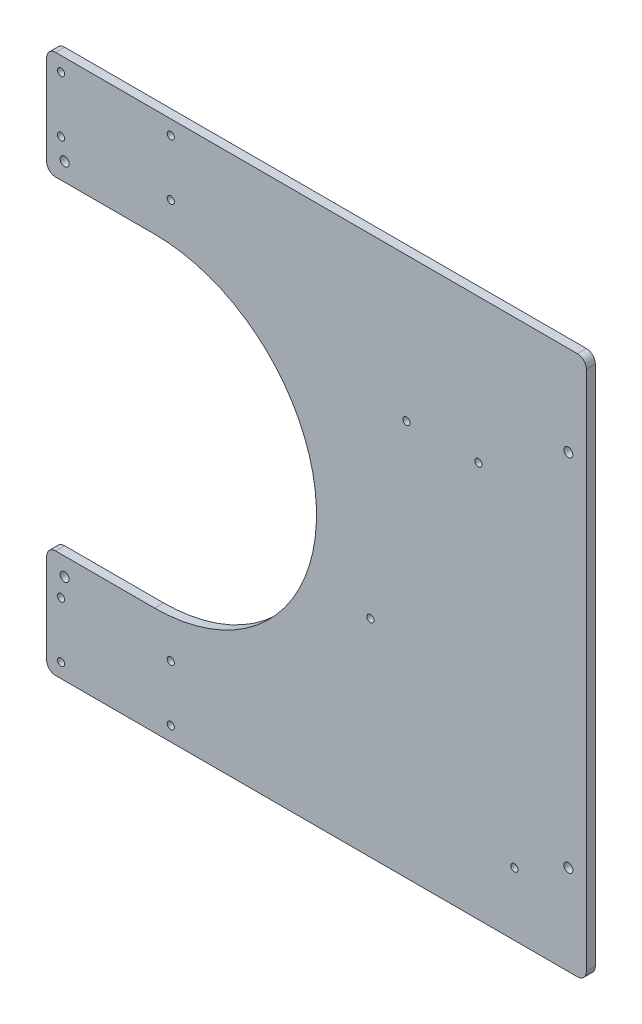
ISO-10303-21;
HEADER;
FILE_DESCRIPTION(('STEP AP214'),'2;1');
FILE_NAME('part.step','',(''),(''),'','','');
FILE_SCHEMA(('AUTOMOTIVE_DESIGN { 1 0 10303 214 1 1 1 1 }'));
ENDSEC;
DATA;
#1=APPLICATION_CONTEXT('core data for automotive mechanical design processes');
#2=APPLICATION_PROTOCOL_DEFINITION('international standard','automotive_design',2000,#1);
#3=PRODUCT_CONTEXT('',#1,'mechanical');
#4=PRODUCT('Part','Part','',(#3));
#5=PRODUCT_RELATED_PRODUCT_CATEGORY('part','',(#4));
#6=PRODUCT_DEFINITION_FORMATION('','',#4);
#7=PRODUCT_DEFINITION_CONTEXT('part definition',#1,'design');
#8=PRODUCT_DEFINITION('design','',#6,#7);
#9=PRODUCT_DEFINITION_SHAPE('','',#8);
#10=(LENGTH_UNIT() NAMED_UNIT(*) SI_UNIT(.MILLI.,.METRE.));
#11=(NAMED_UNIT(*) PLANE_ANGLE_UNIT() SI_UNIT($,.RADIAN.));
#12=(NAMED_UNIT(*) SI_UNIT($,.STERADIAN.) SOLID_ANGLE_UNIT());
#13=UNCERTAINTY_MEASURE_WITH_UNIT(LENGTH_MEASURE(1.E-05),#10,'distance_accuracy_value','');
#14=(GEOMETRIC_REPRESENTATION_CONTEXT(3) GLOBAL_UNCERTAINTY_ASSIGNED_CONTEXT((#13)) GLOBAL_UNIT_ASSIGNED_CONTEXT((#10,
#11,#12)) REPRESENTATION_CONTEXT('',''));
#15=CARTESIAN_POINT('',(0.,0.,0.));
#16=DIRECTION('',(0.,0.,1.));
#17=DIRECTION('',(1.,0.,0.));
#18=AXIS2_PLACEMENT_3D('',#15,#16,#17);
#19=CARTESIAN_POINT('',(60.,150.,5.));
#20=DIRECTION('',(0.,0.,-1.));
#21=DIRECTION('',(-1.,0.,0.));
#22=AXIS2_PLACEMENT_3D('',#19,#20,#21);
#23=PLANE('',#22);
#24=CARTESIAN_POINT('',(60.,150.,5.));
#25=DIRECTION('',(0.,0.,-1.));
#26=DIRECTION('',(-1.,0.,0.));
#27=AXIS2_PLACEMENT_3D('',#24,#25,#26);
#28=CIRCLE('',#27,90.);
#29=CARTESIAN_POINT('',(60.,240.,5.));
#30=VERTEX_POINT('',#29);
#31=CARTESIAN_POINT('',(60.,60.,5.));
#32=VERTEX_POINT('',#31);
#33=EDGE_CURVE('E224',#30,#32,#28,.T.);
#34=ORIENTED_EDGE('',*,*,#33,.T.);
#35=DIRECTION('',(-1.,0.,0.));
#36=VECTOR('',#35,1.);
#37=CARTESIAN_POINT('',(5.00000000000004,60.,5.));
#38=LINE('',#37,#36);
#39=CARTESIAN_POINT('',(5.00000000000004,60.,5.));
#40=VERTEX_POINT('',#39);
#41=EDGE_CURVE('E124',#32,#40,#38,.T.);
#42=ORIENTED_EDGE('',*,*,#41,.T.);
#43=CARTESIAN_POINT('',(5.,55.,5.));
#44=DIRECTION('',(0.,0.,1.));
#45=DIRECTION('',(-1.,0.,0.));
#46=AXIS2_PLACEMENT_3D('',#43,#44,#45);
#47=CIRCLE('',#46,5.);
#48=CARTESIAN_POINT('',(0.,55.,5.));
#49=VERTEX_POINT('',#48);
#50=EDGE_CURVE('E269',#40,#49,#47,.T.);
#51=ORIENTED_EDGE('',*,*,#50,.T.);
#52=DIRECTION('',(0.,-1.,0.));
#53=VECTOR('',#52,1.);
#54=CARTESIAN_POINT('',(0.,4.99999999999994,5.));
#55=LINE('',#54,#53);
#56=CARTESIAN_POINT('',(0.,4.99999999999994,5.));
#57=VERTEX_POINT('',#56);
#58=EDGE_CURVE('E289',#49,#57,#55,.T.);
#59=ORIENTED_EDGE('',*,*,#58,.T.);
#60=CARTESIAN_POINT('',(5.,5.,5.));
#61=DIRECTION('',(0.,0.,1.));
#62=DIRECTION('',(-1.,0.,0.));
#63=AXIS2_PLACEMENT_3D('',#60,#61,#62);
#64=CIRCLE('',#63,5.);
#65=CARTESIAN_POINT('',(5.00000000000004,0.,5.));
#66=VERTEX_POINT('',#65);
#67=EDGE_CURVE('E285',#57,#66,#64,.T.);
#68=ORIENTED_EDGE('',*,*,#67,.T.);
#69=DIRECTION('',(1.,0.,0.));
#70=VECTOR('',#69,1.);
#71=CARTESIAN_POINT('',(5.00000000000004,0.,5.));
#72=LINE('',#71,#70);
#73=CARTESIAN_POINT('',(295.,0.,5.));
#74=VERTEX_POINT('',#73);
#75=EDGE_CURVE('E288',#66,#74,#72,.T.);
#76=ORIENTED_EDGE('',*,*,#75,.T.);
#77=CARTESIAN_POINT('',(295.,5.,5.));
#78=DIRECTION('',(0.,0.,1.));
#79=DIRECTION('',(1.,0.,0.));
#80=AXIS2_PLACEMENT_3D('',#77,#78,#79);
#81=CIRCLE('',#80,5.);
#82=CARTESIAN_POINT('',(300.,5.,5.));
#83=VERTEX_POINT('',#82);
#84=EDGE_CURVE('E293',#74,#83,#81,.T.);
#85=ORIENTED_EDGE('',*,*,#84,.T.);
#86=DIRECTION('',(0.,1.,0.));
#87=VECTOR('',#86,1.);
#88=CARTESIAN_POINT('',(300.,5.00000000000004,5.));
#89=LINE('',#88,#87);
#90=CARTESIAN_POINT('',(300.,295.,5.));
#91=VERTEX_POINT('',#90);
#92=EDGE_CURVE('E300',#83,#91,#89,.T.);
#93=ORIENTED_EDGE('',*,*,#92,.T.);
#94=CARTESIAN_POINT('',(295.,295.,5.));
#95=DIRECTION('',(0.,0.,1.));
#96=DIRECTION('',(-1.,0.,0.));
#97=AXIS2_PLACEMENT_3D('',#94,#95,#96);
#98=CIRCLE('',#97,5.);
#99=CARTESIAN_POINT('',(295.,300.,5.));
#100=VERTEX_POINT('',#99);
#101=EDGE_CURVE('E303',#91,#100,#98,.T.);
#102=ORIENTED_EDGE('',*,*,#101,.T.);
#103=DIRECTION('',(-1.,0.,0.));
#104=VECTOR('',#103,1.);
#105=CARTESIAN_POINT('',(5.00000000000004,300.,5.));
#106=LINE('',#105,#104);
#107=CARTESIAN_POINT('',(5.00000000000004,300.,5.));
#108=VERTEX_POINT('',#107);
#109=EDGE_CURVE('E306',#100,#108,#106,.T.);
#110=ORIENTED_EDGE('',*,*,#109,.T.);
#111=CARTESIAN_POINT('',(5.,295.,5.));
#112=DIRECTION('',(0.,0.,1.));
#113=DIRECTION('',(-1.,0.,0.));
#114=AXIS2_PLACEMENT_3D('',#111,#112,#113);
#115=CIRCLE('',#114,5.);
#116=CARTESIAN_POINT('',(0.,295.,5.));
#117=VERTEX_POINT('',#116);
#118=EDGE_CURVE('E161',#108,#117,#115,.T.);
#119=ORIENTED_EDGE('',*,*,#118,.T.);
#120=DIRECTION('',(0.,-1.,0.));
#121=VECTOR('',#120,1.);
#122=CARTESIAN_POINT('',(0.,245.,5.));
#123=LINE('',#122,#121);
#124=CARTESIAN_POINT('',(0.,245.,5.));
#125=VERTEX_POINT('',#124);
#126=EDGE_CURVE('E155',#117,#125,#123,.T.);
#127=ORIENTED_EDGE('',*,*,#126,.T.);
#128=CARTESIAN_POINT('',(5.,245.,5.));
#129=DIRECTION('',(0.,0.,1.));
#130=DIRECTION('',(-1.,0.,0.));
#131=AXIS2_PLACEMENT_3D('',#128,#129,#130);
#132=CIRCLE('',#131,5.);
#133=CARTESIAN_POINT('',(5.00000000000004,240.,5.));
#134=VERTEX_POINT('',#133);
#135=EDGE_CURVE('E159',#125,#134,#132,.T.);
#136=ORIENTED_EDGE('',*,*,#135,.T.);
#137=DIRECTION('',(1.,0.,0.));
#138=VECTOR('',#137,1.);
#139=CARTESIAN_POINT('',(5.00000000000004,240.,5.));
#140=LINE('',#139,#138);
#141=EDGE_CURVE('E63',#134,#30,#140,.T.);
#142=ORIENTED_EDGE('',*,*,#141,.T.);
#143=EDGE_LOOP('',(#34,#42,#51,#59,#68,#76,#85,#93,#102,#110,#119,#127,#136,#142));
#144=FACE_BOUND('',#143,.T.);
#145=CARTESIAN_POINT('',(10.,250.,5.));
#146=DIRECTION('',(0.,0.,1.));
#147=DIRECTION('',(1.,0.,0.));
#148=AXIS2_PLACEMENT_3D('',#145,#146,#147);
#149=CIRCLE('',#148,2.5);
#150=CARTESIAN_POINT('',(12.5,250.,5.));
#151=VERTEX_POINT('',#150);
#152=EDGE_CURVE('E188',#151,#151,#149,.T.);
#153=ORIENTED_EDGE('',*,*,#152,.F.);
#154=EDGE_LOOP('',(#153));
#155=FACE_BOUND('',#154,.T.);
#156=CARTESIAN_POINT('',(290.,250.,5.));
#157=DIRECTION('',(0.,0.,1.));
#158=DIRECTION('',(-1.,0.,0.));
#159=AXIS2_PLACEMENT_3D('',#156,#157,#158);
#160=CIRCLE('',#159,2.50000000000002);
#161=CARTESIAN_POINT('',(287.5,250.,5.));
#162=VERTEX_POINT('',#161);
#163=EDGE_CURVE('E520',#162,#162,#160,.T.);
#164=ORIENTED_EDGE('',*,*,#163,.F.);
#165=EDGE_LOOP('',(#164));
#166=FACE_BOUND('',#165,.T.);
#167=CARTESIAN_POINT('',(7.99999999999993,292.,5.));
#168=DIRECTION('',(0.,0.,1.));
#169=DIRECTION('',(1.,0.,0.));
#170=AXIS2_PLACEMENT_3D('',#167,#168,#169);
#171=CIRCLE('',#170,2.);
#172=CARTESIAN_POINT('',(9.99999999999993,292.,5.));
#173=VERTEX_POINT('',#172);
#174=EDGE_CURVE('E512',#173,#173,#171,.T.);
#175=ORIENTED_EDGE('',*,*,#174,.F.);
#176=EDGE_LOOP('',(#175));
#177=FACE_BOUND('',#176,.T.);
#178=CARTESIAN_POINT('',(68.9999999999999,292.,5.));
#179=DIRECTION('',(0.,0.,1.));
#180=DIRECTION('',(1.,0.,0.));
#181=AXIS2_PLACEMENT_3D('',#178,#179,#180);
#182=CIRCLE('',#181,2.);
#183=CARTESIAN_POINT('',(70.9999999999999,292.,5.));
#184=VERTEX_POINT('',#183);
#185=EDGE_CURVE('E504',#184,#184,#182,.T.);
#186=ORIENTED_EDGE('',*,*,#185,.F.);
#187=EDGE_LOOP('',(#186));
#188=FACE_BOUND('',#187,.T.);
#189=CARTESIAN_POINT('',(10.,50.,5.));
#190=DIRECTION('',(0.,0.,1.));
#191=DIRECTION('',(-1.,0.,0.));
#192=AXIS2_PLACEMENT_3D('',#189,#190,#191);
#193=CIRCLE('',#192,2.5);
#194=CARTESIAN_POINT('',(7.5,50.,5.));
#195=VERTEX_POINT('',#194);
#196=EDGE_CURVE('E496',#195,#195,#193,.T.);
#197=ORIENTED_EDGE('',*,*,#196,.F.);
#198=EDGE_LOOP('',(#197));
#199=FACE_BOUND('',#198,.T.);
#200=CARTESIAN_POINT('',(290.,50.,5.));
#201=DIRECTION('',(0.,0.,1.));
#202=DIRECTION('',(1.,0.,0.));
#203=AXIS2_PLACEMENT_3D('',#200,#201,#202);
#204=CIRCLE('',#203,2.50000000000002);
#205=CARTESIAN_POINT('',(292.5,50.,5.));
#206=VERTEX_POINT('',#205);
#207=EDGE_CURVE('E488',#206,#206,#204,.T.);
#208=ORIENTED_EDGE('',*,*,#207,.F.);
#209=EDGE_LOOP('',(#208));
#210=FACE_BOUND('',#209,.T.);
#211=CARTESIAN_POINT('',(68.9999999999999,261.,5.));
#212=DIRECTION('',(0.,0.,1.));
#213=DIRECTION('',(1.,0.,0.));
#214=AXIS2_PLACEMENT_3D('',#211,#212,#213);
#215=CIRCLE('',#214,1.99999999999998);
#216=CARTESIAN_POINT('',(70.9999999999999,261.,5.));
#217=VERTEX_POINT('',#216);
#218=EDGE_CURVE('E480',#217,#217,#215,.T.);
#219=ORIENTED_EDGE('',*,*,#218,.F.);
#220=EDGE_LOOP('',(#219));
#221=FACE_BOUND('',#220,.T.);
#222=CARTESIAN_POINT('',(7.99999999999993,261.,5.));
#223=DIRECTION('',(0.,0.,1.));
#224=DIRECTION('',(1.,0.,0.));
#225=AXIS2_PLACEMENT_3D('',#222,#223,#224);
#226=CIRCLE('',#225,2.);
#227=CARTESIAN_POINT('',(9.99999999999993,261.,5.));
#228=VERTEX_POINT('',#227);
#229=EDGE_CURVE('E472',#228,#228,#226,.T.);
#230=ORIENTED_EDGE('',*,*,#229,.F.);
#231=EDGE_LOOP('',(#230));
#232=FACE_BOUND('',#231,.T.);
#233=CARTESIAN_POINT('',(7.99999999999993,38.9999999999999,5.));
#234=DIRECTION('',(0.,0.,1.));
#235=DIRECTION('',(-1.,0.,0.));
#236=AXIS2_PLACEMENT_3D('',#233,#234,#235);
#237=CIRCLE('',#236,2.);
#238=CARTESIAN_POINT('',(5.99999999999993,38.9999999999999,5.));
#239=VERTEX_POINT('',#238);
#240=EDGE_CURVE('E464',#239,#239,#237,.T.);
#241=ORIENTED_EDGE('',*,*,#240,.F.);
#242=EDGE_LOOP('',(#241));
#243=FACE_BOUND('',#242,.T.);
#244=CARTESIAN_POINT('',(68.9999999999999,38.9999999999999,5.));
#245=DIRECTION('',(0.,0.,1.));
#246=DIRECTION('',(-1.,0.,0.));
#247=AXIS2_PLACEMENT_3D('',#244,#245,#246);
#248=CIRCLE('',#247,2.);
#249=CARTESIAN_POINT('',(66.9999999999999,38.9999999999999,5.));
#250=VERTEX_POINT('',#249);
#251=EDGE_CURVE('E456',#250,#250,#248,.T.);
#252=ORIENTED_EDGE('',*,*,#251,.F.);
#253=EDGE_LOOP('',(#252));
#254=FACE_BOUND('',#253,.T.);
#255=CARTESIAN_POINT('',(68.9999999999999,7.99999999999995,5.));
#256=DIRECTION('',(0.,0.,1.));
#257=DIRECTION('',(-1.,0.,0.));
#258=AXIS2_PLACEMENT_3D('',#255,#256,#257);
#259=CIRCLE('',#258,2.);
#260=CARTESIAN_POINT('',(66.9999999999999,7.99999999999995,5.));
#261=VERTEX_POINT('',#260);
#262=EDGE_CURVE('E448',#261,#261,#259,.T.);
#263=ORIENTED_EDGE('',*,*,#262,.F.);
#264=EDGE_LOOP('',(#263));
#265=FACE_BOUND('',#264,.T.);
#266=CARTESIAN_POINT('',(7.99999999999993,7.99999999999995,5.));
#267=DIRECTION('',(0.,0.,1.));
#268=DIRECTION('',(-1.,0.,0.));
#269=AXIS2_PLACEMENT_3D('',#266,#267,#268);
#270=CIRCLE('',#269,2.);
#271=CARTESIAN_POINT('',(5.99999999999993,7.99999999999995,5.));
#272=VERTEX_POINT('',#271);
#273=EDGE_CURVE('E440',#272,#272,#270,.T.);
#274=ORIENTED_EDGE('',*,*,#273,.F.);
#275=EDGE_LOOP('',(#274));
#276=FACE_BOUND('',#275,.T.);
#277=CARTESIAN_POINT('',(200.,220.,5.));
#278=DIRECTION('',(0.,0.,1.));
#279=DIRECTION('',(1.,0.,0.));
#280=AXIS2_PLACEMENT_3D('',#277,#278,#279);
#281=CIRCLE('',#280,2.);
#282=CARTESIAN_POINT('',(202.,220.,5.));
#283=VERTEX_POINT('',#282);
#284=EDGE_CURVE('E432',#283,#283,#281,.T.);
#285=ORIENTED_EDGE('',*,*,#284,.F.);
#286=EDGE_LOOP('',(#285));
#287=FACE_BOUND('',#286,.T.);
#288=CARTESIAN_POINT('',(240.,220.,5.));
#289=DIRECTION('',(0.,0.,1.));
#290=DIRECTION('',(1.,0.,0.));
#291=AXIS2_PLACEMENT_3D('',#288,#289,#290);
#292=CIRCLE('',#291,2.);
#293=CARTESIAN_POINT('',(242.,220.,5.));
#294=VERTEX_POINT('',#293);
#295=EDGE_CURVE('E424',#294,#294,#292,.T.);
#296=ORIENTED_EDGE('',*,*,#295,.F.);
#297=EDGE_LOOP('',(#296));
#298=FACE_BOUND('',#297,.T.);
#299=CARTESIAN_POINT('',(180.,115.,5.));
#300=DIRECTION('',(0.,0.,1.));
#301=DIRECTION('',(1.,0.,0.));
#302=AXIS2_PLACEMENT_3D('',#299,#300,#301);
#303=CIRCLE('',#302,2.);
#304=CARTESIAN_POINT('',(182.,115.,5.));
#305=VERTEX_POINT('',#304);
#306=EDGE_CURVE('E416',#305,#305,#303,.T.);
#307=ORIENTED_EDGE('',*,*,#306,.F.);
#308=EDGE_LOOP('',(#307));
#309=FACE_BOUND('',#308,.T.);
#310=CARTESIAN_POINT('',(260.,35.,5.));
#311=DIRECTION('',(0.,0.,1.));
#312=DIRECTION('',(1.,0.,0.));
#313=AXIS2_PLACEMENT_3D('',#310,#311,#312);
#314=CIRCLE('',#313,2.);
#315=CARTESIAN_POINT('',(262.,35.,5.));
#316=VERTEX_POINT('',#315);
#317=EDGE_CURVE('E405',#316,#316,#314,.T.);
#318=ORIENTED_EDGE('',*,*,#317,.F.);
#319=EDGE_LOOP('',(#318));
#320=FACE_BOUND('',#319,.T.);
#321=ADVANCED_FACE('F45',(#144,#155,#166,#177,#188,#199,#210,#221,#232,#243,#254,#265,#276,#287,
#298,#309,#320),#23,.F.);
#322=CARTESIAN_POINT('',(60.,150.,0.));
#323=DIRECTION('',(0.,0.,-1.));
#324=DIRECTION('',(-1.,0.,0.));
#325=AXIS2_PLACEMENT_3D('',#322,#323,#324);
#326=PLANE('',#325);
#327=CARTESIAN_POINT('',(180.,115.,0.));
#328=DIRECTION('',(0.,0.,1.));
#329=DIRECTION('',(1.,0.,0.));
#330=AXIS2_PLACEMENT_3D('',#327,#328,#329);
#331=CIRCLE('',#330,2.);
#332=CARTESIAN_POINT('',(182.,115.,0.));
#333=VERTEX_POINT('',#332);
#334=EDGE_CURVE('E413',#333,#333,#331,.T.);
#335=ORIENTED_EDGE('',*,*,#334,.T.);
#336=EDGE_LOOP('',(#335));
#337=FACE_BOUND('',#336,.T.);
#338=CARTESIAN_POINT('',(200.,220.,0.));
#339=DIRECTION('',(0.,0.,1.));
#340=DIRECTION('',(1.,0.,0.));
#341=AXIS2_PLACEMENT_3D('',#338,#339,#340);
#342=CIRCLE('',#341,2.);
#343=CARTESIAN_POINT('',(202.,220.,0.));
#344=VERTEX_POINT('',#343);
#345=EDGE_CURVE('E428',#344,#344,#342,.T.);
#346=ORIENTED_EDGE('',*,*,#345,.T.);
#347=EDGE_LOOP('',(#346));
#348=FACE_BOUND('',#347,.T.);
#349=CARTESIAN_POINT('',(68.9999999999999,7.99999999999995,0.));
#350=DIRECTION('',(0.,0.,1.));
#351=DIRECTION('',(-1.,0.,0.));
#352=AXIS2_PLACEMENT_3D('',#349,#350,#351);
#353=CIRCLE('',#352,2.);
#354=CARTESIAN_POINT('',(66.9999999999999,7.99999999999995,0.));
#355=VERTEX_POINT('',#354);
#356=EDGE_CURVE('E444',#355,#355,#353,.T.);
#357=ORIENTED_EDGE('',*,*,#356,.T.);
#358=EDGE_LOOP('',(#357));
#359=FACE_BOUND('',#358,.T.);
#360=CARTESIAN_POINT('',(7.99999999999993,38.9999999999999,0.));
#361=DIRECTION('',(0.,0.,1.));
#362=DIRECTION('',(-1.,0.,0.));
#363=AXIS2_PLACEMENT_3D('',#360,#361,#362);
#364=CIRCLE('',#363,2.);
#365=CARTESIAN_POINT('',(5.99999999999993,38.9999999999999,0.));
#366=VERTEX_POINT('',#365);
#367=EDGE_CURVE('E460',#366,#366,#364,.T.);
#368=ORIENTED_EDGE('',*,*,#367,.T.);
#369=EDGE_LOOP('',(#368));
#370=FACE_BOUND('',#369,.T.);
#371=CARTESIAN_POINT('',(68.9999999999999,261.,0.));
#372=DIRECTION('',(0.,0.,1.));
#373=DIRECTION('',(1.,0.,0.));
#374=AXIS2_PLACEMENT_3D('',#371,#372,#373);
#375=CIRCLE('',#374,1.99999999999998);
#376=CARTESIAN_POINT('',(70.9999999999999,261.,0.));
#377=VERTEX_POINT('',#376);
#378=EDGE_CURVE('E476',#377,#377,#375,.T.);
#379=ORIENTED_EDGE('',*,*,#378,.T.);
#380=EDGE_LOOP('',(#379));
#381=FACE_BOUND('',#380,.T.);
#382=CARTESIAN_POINT('',(10.,50.,0.));
#383=DIRECTION('',(0.,0.,1.));
#384=DIRECTION('',(-1.,0.,0.));
#385=AXIS2_PLACEMENT_3D('',#382,#383,#384);
#386=CIRCLE('',#385,2.5);
#387=CARTESIAN_POINT('',(7.5,50.,0.));
#388=VERTEX_POINT('',#387);
#389=EDGE_CURVE('E492',#388,#388,#386,.T.);
#390=ORIENTED_EDGE('',*,*,#389,.T.);
#391=EDGE_LOOP('',(#390));
#392=FACE_BOUND('',#391,.T.);
#393=CARTESIAN_POINT('',(7.99999999999993,292.,0.));
#394=DIRECTION('',(0.,0.,1.));
#395=DIRECTION('',(1.,0.,0.));
#396=AXIS2_PLACEMENT_3D('',#393,#394,#395);
#397=CIRCLE('',#396,2.);
#398=CARTESIAN_POINT('',(9.99999999999993,292.,0.));
#399=VERTEX_POINT('',#398);
#400=EDGE_CURVE('E508',#399,#399,#397,.T.);
#401=ORIENTED_EDGE('',*,*,#400,.T.);
#402=EDGE_LOOP('',(#401));
#403=FACE_BOUND('',#402,.T.);
#404=CARTESIAN_POINT('',(10.,250.,0.));
#405=DIRECTION('',(0.,0.,1.));
#406=DIRECTION('',(1.,0.,0.));
#407=AXIS2_PLACEMENT_3D('',#404,#405,#406);
#408=CIRCLE('',#407,2.5);
#409=CARTESIAN_POINT('',(12.5,250.,0.));
#410=VERTEX_POINT('',#409);
#411=EDGE_CURVE('E524',#410,#410,#408,.T.);
#412=ORIENTED_EDGE('',*,*,#411,.T.);
#413=EDGE_LOOP('',(#412));
#414=FACE_BOUND('',#413,.T.);
#415=CARTESIAN_POINT('',(60.,150.,0.));
#416=DIRECTION('',(0.,0.,-1.));
#417=DIRECTION('',(-1.,0.,0.));
#418=AXIS2_PLACEMENT_3D('',#415,#416,#417);
#419=CIRCLE('',#418,90.);
#420=CARTESIAN_POINT('',(60.,240.,0.));
#421=VERTEX_POINT('',#420);
#422=CARTESIAN_POINT('',(60.,60.,0.));
#423=VERTEX_POINT('',#422);
#424=EDGE_CURVE('E183',#421,#423,#419,.T.);
#425=ORIENTED_EDGE('',*,*,#424,.F.);
#426=DIRECTION('',(1.,0.,0.));
#427=VECTOR('',#426,1.);
#428=CARTESIAN_POINT('',(5.00000000000004,240.,0.));
#429=LINE('',#428,#427);
#430=CARTESIAN_POINT('',(5.00000000000004,240.,0.));
#431=VERTEX_POINT('',#430);
#432=EDGE_CURVE('E116',#431,#421,#429,.T.);
#433=ORIENTED_EDGE('',*,*,#432,.F.);
#434=CARTESIAN_POINT('',(5.,245.,0.));
#435=DIRECTION('',(0.,0.,1.));
#436=DIRECTION('',(-1.,0.,0.));
#437=AXIS2_PLACEMENT_3D('',#434,#435,#436);
#438=CIRCLE('',#437,5.);
#439=CARTESIAN_POINT('',(0.,245.,0.));
#440=VERTEX_POINT('',#439);
#441=EDGE_CURVE('E110',#440,#431,#438,.T.);
#442=ORIENTED_EDGE('',*,*,#441,.F.);
#443=DIRECTION('',(0.,-1.,0.));
#444=VECTOR('',#443,1.);
#445=CARTESIAN_POINT('',(0.,245.,0.));
#446=LINE('',#445,#444);
#447=CARTESIAN_POINT('',(0.,295.,0.));
#448=VERTEX_POINT('',#447);
#449=EDGE_CURVE('E170',#448,#440,#446,.T.);
#450=ORIENTED_EDGE('',*,*,#449,.F.);
#451=CARTESIAN_POINT('',(5.,295.,0.));
#452=DIRECTION('',(0.,0.,1.));
#453=DIRECTION('',(-1.,0.,0.));
#454=AXIS2_PLACEMENT_3D('',#451,#452,#453);
#455=CIRCLE('',#454,5.);
#456=CARTESIAN_POINT('',(5.00000000000004,300.,0.));
#457=VERTEX_POINT('',#456);
#458=EDGE_CURVE('E215',#457,#448,#455,.T.);
#459=ORIENTED_EDGE('',*,*,#458,.F.);
#460=DIRECTION('',(-1.,0.,0.));
#461=VECTOR('',#460,1.);
#462=CARTESIAN_POINT('',(5.00000000000004,300.,0.));
#463=LINE('',#462,#461);
#464=CARTESIAN_POINT('',(295.,300.,0.));
#465=VERTEX_POINT('',#464);
#466=EDGE_CURVE('E212',#465,#457,#463,.T.);
#467=ORIENTED_EDGE('',*,*,#466,.F.);
#468=CARTESIAN_POINT('',(295.,295.,0.));
#469=DIRECTION('',(0.,0.,1.));
#470=DIRECTION('',(-1.,0.,0.));
#471=AXIS2_PLACEMENT_3D('',#468,#469,#470);
#472=CIRCLE('',#471,5.);
#473=CARTESIAN_POINT('',(300.,295.,0.));
#474=VERTEX_POINT('',#473);
#475=EDGE_CURVE('E209',#474,#465,#472,.T.);
#476=ORIENTED_EDGE('',*,*,#475,.F.);
#477=DIRECTION('',(0.,1.,0.));
#478=VECTOR('',#477,1.);
#479=CARTESIAN_POINT('',(300.,5.00000000000004,0.));
#480=LINE('',#479,#478);
#481=CARTESIAN_POINT('',(300.,5.,0.));
#482=VERTEX_POINT('',#481);
#483=EDGE_CURVE('E206',#482,#474,#480,.T.);
#484=ORIENTED_EDGE('',*,*,#483,.F.);
#485=CARTESIAN_POINT('',(295.,5.,0.));
#486=DIRECTION('',(0.,0.,1.));
#487=DIRECTION('',(1.,0.,0.));
#488=AXIS2_PLACEMENT_3D('',#485,#486,#487);
#489=CIRCLE('',#488,5.);
#490=CARTESIAN_POINT('',(295.,0.,0.));
#491=VERTEX_POINT('',#490);
#492=EDGE_CURVE('E203',#491,#482,#489,.T.);
#493=ORIENTED_EDGE('',*,*,#492,.F.);
#494=DIRECTION('',(1.,0.,0.));
#495=VECTOR('',#494,1.);
#496=CARTESIAN_POINT('',(5.00000000000004,0.,0.));
#497=LINE('',#496,#495);
#498=CARTESIAN_POINT('',(5.00000000000004,0.,0.));
#499=VERTEX_POINT('',#498);
#500=EDGE_CURVE('E200',#499,#491,#497,.T.);
#501=ORIENTED_EDGE('',*,*,#500,.F.);
#502=CARTESIAN_POINT('',(5.,5.,0.));
#503=DIRECTION('',(0.,0.,1.));
#504=DIRECTION('',(-1.,0.,0.));
#505=AXIS2_PLACEMENT_3D('',#502,#503,#504);
#506=CIRCLE('',#505,5.);
#507=CARTESIAN_POINT('',(0.,4.99999999999994,0.));
#508=VERTEX_POINT('',#507);
#509=EDGE_CURVE('E197',#508,#499,#506,.T.);
#510=ORIENTED_EDGE('',*,*,#509,.F.);
#511=DIRECTION('',(0.,-1.,0.));
#512=VECTOR('',#511,1.);
#513=CARTESIAN_POINT('',(0.,4.99999999999994,0.));
#514=LINE('',#513,#512);
#515=CARTESIAN_POINT('',(0.,55.,0.));
#516=VERTEX_POINT('',#515);
#517=EDGE_CURVE('E194',#516,#508,#514,.T.);
#518=ORIENTED_EDGE('',*,*,#517,.F.);
#519=CARTESIAN_POINT('',(5.,55.,0.));
#520=DIRECTION('',(0.,0.,1.));
#521=DIRECTION('',(-1.,0.,0.));
#522=AXIS2_PLACEMENT_3D('',#519,#520,#521);
#523=CIRCLE('',#522,5.);
#524=CARTESIAN_POINT('',(5.00000000000004,60.,0.));
#525=VERTEX_POINT('',#524);
#526=EDGE_CURVE('E191',#525,#516,#523,.T.);
#527=ORIENTED_EDGE('',*,*,#526,.F.);
#528=DIRECTION('',(-1.,0.,0.));
#529=VECTOR('',#528,1.);
#530=CARTESIAN_POINT('',(5.00000000000004,60.,0.));
#531=LINE('',#530,#529);
#532=EDGE_CURVE('E187',#423,#525,#531,.T.);
#533=ORIENTED_EDGE('',*,*,#532,.F.);
#534=EDGE_LOOP('',(#425,#433,#442,#450,#459,#467,#476,#484,#493,#501,#510,#518,#527,#533));
#535=FACE_BOUND('',#534,.T.);
#536=CARTESIAN_POINT('',(290.,250.,0.));
#537=DIRECTION('',(0.,0.,1.));
#538=DIRECTION('',(-1.,0.,0.));
#539=AXIS2_PLACEMENT_3D('',#536,#537,#538);
#540=CIRCLE('',#539,2.50000000000002);
#541=CARTESIAN_POINT('',(287.5,250.,0.));
#542=VERTEX_POINT('',#541);
#543=EDGE_CURVE('E516',#542,#542,#540,.T.);
#544=ORIENTED_EDGE('',*,*,#543,.T.);
#545=EDGE_LOOP('',(#544));
#546=FACE_BOUND('',#545,.T.);
#547=CARTESIAN_POINT('',(68.9999999999999,292.,0.));
#548=DIRECTION('',(0.,0.,1.));
#549=DIRECTION('',(1.,0.,0.));
#550=AXIS2_PLACEMENT_3D('',#547,#548,#549);
#551=CIRCLE('',#550,2.);
#552=CARTESIAN_POINT('',(70.9999999999999,292.,0.));
#553=VERTEX_POINT('',#552);
#554=EDGE_CURVE('E500',#553,#553,#551,.T.);
#555=ORIENTED_EDGE('',*,*,#554,.T.);
#556=EDGE_LOOP('',(#555));
#557=FACE_BOUND('',#556,.T.);
#558=CARTESIAN_POINT('',(290.,50.,0.));
#559=DIRECTION('',(0.,0.,1.));
#560=DIRECTION('',(1.,0.,0.));
#561=AXIS2_PLACEMENT_3D('',#558,#559,#560);
#562=CIRCLE('',#561,2.50000000000002);
#563=CARTESIAN_POINT('',(292.5,50.,0.));
#564=VERTEX_POINT('',#563);
#565=EDGE_CURVE('E484',#564,#564,#562,.T.);
#566=ORIENTED_EDGE('',*,*,#565,.T.);
#567=EDGE_LOOP('',(#566));
#568=FACE_BOUND('',#567,.T.);
#569=CARTESIAN_POINT('',(7.99999999999993,261.,0.));
#570=DIRECTION('',(0.,0.,1.));
#571=DIRECTION('',(1.,0.,0.));
#572=AXIS2_PLACEMENT_3D('',#569,#570,#571);
#573=CIRCLE('',#572,2.);
#574=CARTESIAN_POINT('',(9.99999999999993,261.,0.));
#575=VERTEX_POINT('',#574);
#576=EDGE_CURVE('E468',#575,#575,#573,.T.);
#577=ORIENTED_EDGE('',*,*,#576,.T.);
#578=EDGE_LOOP('',(#577));
#579=FACE_BOUND('',#578,.T.);
#580=CARTESIAN_POINT('',(68.9999999999999,38.9999999999999,0.));
#581=DIRECTION('',(0.,0.,1.));
#582=DIRECTION('',(-1.,0.,0.));
#583=AXIS2_PLACEMENT_3D('',#580,#581,#582);
#584=CIRCLE('',#583,2.);
#585=CARTESIAN_POINT('',(66.9999999999999,38.9999999999999,0.));
#586=VERTEX_POINT('',#585);
#587=EDGE_CURVE('E452',#586,#586,#584,.T.);
#588=ORIENTED_EDGE('',*,*,#587,.T.);
#589=EDGE_LOOP('',(#588));
#590=FACE_BOUND('',#589,.T.);
#591=CARTESIAN_POINT('',(7.99999999999993,7.99999999999995,0.));
#592=DIRECTION('',(0.,0.,1.));
#593=DIRECTION('',(-1.,0.,0.));
#594=AXIS2_PLACEMENT_3D('',#591,#592,#593);
#595=CIRCLE('',#594,2.);
#596=CARTESIAN_POINT('',(5.99999999999993,7.99999999999995,0.));
#597=VERTEX_POINT('',#596);
#598=EDGE_CURVE('E436',#597,#597,#595,.T.);
#599=ORIENTED_EDGE('',*,*,#598,.T.);
#600=EDGE_LOOP('',(#599));
#601=FACE_BOUND('',#600,.T.);
#602=CARTESIAN_POINT('',(240.,220.,0.));
#603=DIRECTION('',(0.,0.,1.));
#604=DIRECTION('',(1.,0.,0.));
#605=AXIS2_PLACEMENT_3D('',#602,#603,#604);
#606=CIRCLE('',#605,2.);
#607=CARTESIAN_POINT('',(242.,220.,0.));
#608=VERTEX_POINT('',#607);
#609=EDGE_CURVE('E420',#608,#608,#606,.T.);
#610=ORIENTED_EDGE('',*,*,#609,.T.);
#611=EDGE_LOOP('',(#610));
#612=FACE_BOUND('',#611,.T.);
#613=CARTESIAN_POINT('',(260.,35.,0.));
#614=DIRECTION('',(0.,0.,1.));
#615=DIRECTION('',(1.,0.,0.));
#616=AXIS2_PLACEMENT_3D('',#613,#614,#615);
#617=CIRCLE('',#616,2.);
#618=CARTESIAN_POINT('',(262.,35.,0.));
#619=VERTEX_POINT('',#618);
#620=EDGE_CURVE('E408',#619,#619,#617,.T.);
#621=ORIENTED_EDGE('',*,*,#620,.T.);
#622=EDGE_LOOP('',(#621));
#623=FACE_BOUND('',#622,.T.);
#624=ADVANCED_FACE('F273',(#337,#348,#359,#370,#381,#392,#403,#414,#535,#546,#557,#568,#579,
#590,#601,#612,#623),#326,.T.);
#625=CARTESIAN_POINT('',(60.,150.,5.));
#626=DIRECTION('',(0.,0.,-1.));
#627=DIRECTION('',(-1.,0.,0.));
#628=AXIS2_PLACEMENT_3D('',#625,#626,#627);
#629=CYLINDRICAL_SURFACE('',#628,90.);
#630=ORIENTED_EDGE('',*,*,#424,.T.);
#631=DIRECTION('',(0.,0.,-1.));
#632=VECTOR('',#631,1.);
#633=CARTESIAN_POINT('',(60.,60.,5.));
#634=LINE('',#633,#632);
#635=EDGE_CURVE('E11',#32,#423,#634,.T.);
#636=ORIENTED_EDGE('',*,*,#635,.F.);
#637=ORIENTED_EDGE('',*,*,#33,.F.);
#638=DIRECTION('',(0.,0.,-1.));
#639=VECTOR('',#638,1.);
#640=CARTESIAN_POINT('',(60.,240.,5.));
#641=LINE('',#640,#639);
#642=EDGE_CURVE('E179',#30,#421,#641,.T.);
#643=ORIENTED_EDGE('',*,*,#642,.T.);
#644=EDGE_LOOP('',(#630,#636,#637,#643));
#645=FACE_BOUND('',#644,.T.);
#646=ADVANCED_FACE('F47',(#645),#629,.F.);
#647=CARTESIAN_POINT('',(5.00000000000004,60.,5.));
#648=DIRECTION('',(0.,-1.,0.));
#649=DIRECTION('',(0.,0.,-1.));
#650=AXIS2_PLACEMENT_3D('',#647,#648,#649);
#651=PLANE('',#650);
#652=ORIENTED_EDGE('',*,*,#532,.T.);
#653=DIRECTION('',(0.,0.,-1.));
#654=VECTOR('',#653,1.);
#655=CARTESIAN_POINT('',(5.00000000000004,60.,5.));
#656=LINE('',#655,#654);
#657=EDGE_CURVE('E55',#40,#525,#656,.T.);
#658=ORIENTED_EDGE('',*,*,#657,.F.);
#659=ORIENTED_EDGE('',*,*,#41,.F.);
#660=ORIENTED_EDGE('',*,*,#635,.T.);
#661=EDGE_LOOP('',(#652,#658,#659,#660));
#662=FACE_BOUND('',#661,.T.);
#663=ADVANCED_FACE('F786',(#662),#651,.F.);
#664=CARTESIAN_POINT('',(5.,55.,5.));
#665=DIRECTION('',(0.,0.,-1.));
#666=DIRECTION('',(-1.,0.,0.));
#667=AXIS2_PLACEMENT_3D('',#664,#665,#666);
#668=CYLINDRICAL_SURFACE('',#667,5.);
#669=ORIENTED_EDGE('',*,*,#526,.T.);
#670=DIRECTION('',(0.,0.,-1.));
#671=VECTOR('',#670,1.);
#672=CARTESIAN_POINT('',(0.,55.,5.));
#673=LINE('',#672,#671);
#674=EDGE_CURVE('E259',#49,#516,#673,.T.);
#675=ORIENTED_EDGE('',*,*,#674,.F.);
#676=ORIENTED_EDGE('',*,*,#50,.F.);
#677=ORIENTED_EDGE('',*,*,#657,.T.);
#678=EDGE_LOOP('',(#669,#675,#676,#677));
#679=FACE_BOUND('',#678,.T.);
#680=ADVANCED_FACE('F267',(#679),#668,.T.);
#681=CARTESIAN_POINT('',(0.,4.99999999999994,5.));
#682=DIRECTION('',(1.,0.,0.));
#683=DIRECTION('',(0.,1.,0.));
#684=AXIS2_PLACEMENT_3D('',#681,#682,#683);
#685=PLANE('',#684);
#686=ORIENTED_EDGE('',*,*,#517,.T.);
#687=DIRECTION('',(0.,0.,-1.));
#688=VECTOR('',#687,1.);
#689=CARTESIAN_POINT('',(0.,4.99999999999994,5.));
#690=LINE('',#689,#688);
#691=EDGE_CURVE('E255',#57,#508,#690,.T.);
#692=ORIENTED_EDGE('',*,*,#691,.F.);
#693=ORIENTED_EDGE('',*,*,#58,.F.);
#694=ORIENTED_EDGE('',*,*,#674,.T.);
#695=EDGE_LOOP('',(#686,#692,#693,#694));
#696=FACE_BOUND('',#695,.T.);
#697=ADVANCED_FACE('F279',(#696),#685,.F.);
#698=CARTESIAN_POINT('',(5.,5.,5.));
#699=DIRECTION('',(0.,0.,-1.));
#700=DIRECTION('',(-1.,0.,0.));
#701=AXIS2_PLACEMENT_3D('',#698,#699,#700);
#702=CYLINDRICAL_SURFACE('',#701,5.);
#703=ORIENTED_EDGE('',*,*,#509,.T.);
#704=DIRECTION('',(0.,0.,-1.));
#705=VECTOR('',#704,1.);
#706=CARTESIAN_POINT('',(5.00000000000004,0.,5.));
#707=LINE('',#706,#705);
#708=EDGE_CURVE('E251',#66,#499,#707,.T.);
#709=ORIENTED_EDGE('',*,*,#708,.F.);
#710=ORIENTED_EDGE('',*,*,#67,.F.);
#711=ORIENTED_EDGE('',*,*,#691,.T.);
#712=EDGE_LOOP('',(#703,#709,#710,#711));
#713=FACE_BOUND('',#712,.T.);
#714=ADVANCED_FACE('F283',(#713),#702,.T.);
#715=CARTESIAN_POINT('',(5.00000000000004,0.,5.));
#716=DIRECTION('',(0.,1.,0.));
#717=DIRECTION('',(0.,0.,1.));
#718=AXIS2_PLACEMENT_3D('',#715,#716,#717);
#719=PLANE('',#718);
#720=ORIENTED_EDGE('',*,*,#500,.T.);
#721=DIRECTION('',(0.,0.,-1.));
#722=VECTOR('',#721,1.);
#723=CARTESIAN_POINT('',(295.,0.,5.));
#724=LINE('',#723,#722);
#725=EDGE_CURVE('E247',#74,#491,#724,.T.);
#726=ORIENTED_EDGE('',*,*,#725,.F.);
#727=ORIENTED_EDGE('',*,*,#75,.F.);
#728=ORIENTED_EDGE('',*,*,#708,.T.);
#729=EDGE_LOOP('',(#720,#726,#727,#728));
#730=FACE_BOUND('',#729,.T.);
#731=ADVANCED_FACE('F751',(#730),#719,.F.);
#732=CARTESIAN_POINT('',(295.,5.,5.));
#733=DIRECTION('',(0.,0.,-1.));
#734=DIRECTION('',(-1.,0.,0.));
#735=AXIS2_PLACEMENT_3D('',#732,#733,#734);
#736=CYLINDRICAL_SURFACE('',#735,5.);
#737=ORIENTED_EDGE('',*,*,#492,.T.);
#738=DIRECTION('',(0.,0.,-1.));
#739=VECTOR('',#738,1.);
#740=CARTESIAN_POINT('',(300.,5.,5.));
#741=LINE('',#740,#739);
#742=EDGE_CURVE('E243',#83,#482,#741,.T.);
#743=ORIENTED_EDGE('',*,*,#742,.F.);
#744=ORIENTED_EDGE('',*,*,#84,.F.);
#745=ORIENTED_EDGE('',*,*,#725,.T.);
#746=EDGE_LOOP('',(#737,#743,#744,#745));
#747=FACE_BOUND('',#746,.T.);
#748=ADVANCED_FACE('F741',(#747),#736,.T.);
#749=CARTESIAN_POINT('',(300.,5.00000000000004,5.));
#750=DIRECTION('',(-1.,0.,0.));
#751=DIRECTION('',(0.,0.,1.));
#752=AXIS2_PLACEMENT_3D('',#749,#750,#751);
#753=PLANE('',#752);
#754=ORIENTED_EDGE('',*,*,#483,.T.);
#755=DIRECTION('',(0.,0.,-1.));
#756=VECTOR('',#755,1.);
#757=CARTESIAN_POINT('',(300.,295.,5.));
#758=LINE('',#757,#756);
#759=EDGE_CURVE('E239',#91,#474,#758,.T.);
#760=ORIENTED_EDGE('',*,*,#759,.F.);
#761=ORIENTED_EDGE('',*,*,#92,.F.);
#762=ORIENTED_EDGE('',*,*,#742,.T.);
#763=EDGE_LOOP('',(#754,#760,#761,#762));
#764=FACE_BOUND('',#763,.T.);
#765=ADVANCED_FACE('F731',(#764),#753,.F.);
#766=CARTESIAN_POINT('',(295.,295.,5.));
#767=DIRECTION('',(0.,0.,-1.));
#768=DIRECTION('',(-1.,0.,0.));
#769=AXIS2_PLACEMENT_3D('',#766,#767,#768);
#770=CYLINDRICAL_SURFACE('',#769,5.);
#771=ORIENTED_EDGE('',*,*,#475,.T.);
#772=DIRECTION('',(0.,0.,-1.));
#773=VECTOR('',#772,1.);
#774=CARTESIAN_POINT('',(295.,300.,5.));
#775=LINE('',#774,#773);
#776=EDGE_CURVE('E235',#100,#465,#775,.T.);
#777=ORIENTED_EDGE('',*,*,#776,.F.);
#778=ORIENTED_EDGE('',*,*,#101,.F.);
#779=ORIENTED_EDGE('',*,*,#759,.T.);
#780=EDGE_LOOP('',(#771,#777,#778,#779));
#781=FACE_BOUND('',#780,.T.);
#782=ADVANCED_FACE('F722',(#781),#770,.T.);
#783=CARTESIAN_POINT('',(5.00000000000004,300.,5.));
#784=DIRECTION('',(0.,-1.,0.));
#785=DIRECTION('',(0.,0.,-1.));
#786=AXIS2_PLACEMENT_3D('',#783,#784,#785);
#787=PLANE('',#786);
#788=ORIENTED_EDGE('',*,*,#466,.T.);
#789=DIRECTION('',(0.,0.,-1.));
#790=VECTOR('',#789,1.);
#791=CARTESIAN_POINT('',(5.00000000000004,300.,5.));
#792=LINE('',#791,#790);
#793=EDGE_CURVE('E231',#108,#457,#792,.T.);
#794=ORIENTED_EDGE('',*,*,#793,.F.);
#795=ORIENTED_EDGE('',*,*,#109,.F.);
#796=ORIENTED_EDGE('',*,*,#776,.T.);
#797=EDGE_LOOP('',(#788,#794,#795,#796));
#798=FACE_BOUND('',#797,.T.);
#799=ADVANCED_FACE('F314',(#798),#787,.F.);
#800=CARTESIAN_POINT('',(5.,295.,5.));
#801=DIRECTION('',(0.,0.,-1.));
#802=DIRECTION('',(-1.,0.,0.));
#803=AXIS2_PLACEMENT_3D('',#800,#801,#802);
#804=CYLINDRICAL_SURFACE('',#803,5.);
#805=ORIENTED_EDGE('',*,*,#458,.T.);
#806=DIRECTION('',(0.,0.,-1.));
#807=VECTOR('',#806,1.);
#808=CARTESIAN_POINT('',(0.,295.,5.));
#809=LINE('',#808,#807);
#810=EDGE_CURVE('E172',#117,#448,#809,.T.);
#811=ORIENTED_EDGE('',*,*,#810,.F.);
#812=ORIENTED_EDGE('',*,*,#118,.F.);
#813=ORIENTED_EDGE('',*,*,#793,.T.);
#814=EDGE_LOOP('',(#805,#811,#812,#813));
#815=FACE_BOUND('',#814,.T.);
#816=ADVANCED_FACE('F318',(#815),#804,.T.);
#817=CARTESIAN_POINT('',(0.,245.,5.));
#818=DIRECTION('',(1.,0.,0.));
#819=DIRECTION('',(0.,0.,-1.));
#820=AXIS2_PLACEMENT_3D('',#817,#818,#819);
#821=PLANE('',#820);
#822=ORIENTED_EDGE('',*,*,#449,.T.);
#823=DIRECTION('',(0.,0.,-1.));
#824=VECTOR('',#823,1.);
#825=CARTESIAN_POINT('',(0.,245.,5.));
#826=LINE('',#825,#824);
#827=EDGE_CURVE('E167',#125,#440,#826,.T.);
#828=ORIENTED_EDGE('',*,*,#827,.F.);
#829=ORIENTED_EDGE('',*,*,#126,.F.);
#830=ORIENTED_EDGE('',*,*,#810,.T.);
#831=EDGE_LOOP('',(#822,#828,#829,#830));
#832=FACE_BOUND('',#831,.T.);
#833=ADVANCED_FACE('F168',(#832),#821,.F.);
#834=CARTESIAN_POINT('',(5.,245.,5.));
#835=DIRECTION('',(0.,0.,-1.));
#836=DIRECTION('',(-1.,0.,0.));
#837=AXIS2_PLACEMENT_3D('',#834,#835,#836);
#838=CYLINDRICAL_SURFACE('',#837,5.);
#839=ORIENTED_EDGE('',*,*,#441,.T.);
#840=DIRECTION('',(0.,0.,-1.));
#841=VECTOR('',#840,1.);
#842=CARTESIAN_POINT('',(5.00000000000004,240.,5.));
#843=LINE('',#842,#841);
#844=EDGE_CURVE('E173',#134,#431,#843,.T.);
#845=ORIENTED_EDGE('',*,*,#844,.F.);
#846=ORIENTED_EDGE('',*,*,#135,.F.);
#847=ORIENTED_EDGE('',*,*,#827,.T.);
#848=EDGE_LOOP('',(#839,#845,#846,#847));
#849=FACE_BOUND('',#848,.T.);
#850=ADVANCED_FACE('F175',(#849),#838,.T.);
#851=CARTESIAN_POINT('',(5.00000000000004,240.,5.));
#852=DIRECTION('',(0.,1.,0.));
#853=DIRECTION('',(0.,0.,1.));
#854=AXIS2_PLACEMENT_3D('',#851,#852,#853);
#855=PLANE('',#854);
#856=ORIENTED_EDGE('',*,*,#432,.T.);
#857=ORIENTED_EDGE('',*,*,#642,.F.);
#858=ORIENTED_EDGE('',*,*,#141,.F.);
#859=ORIENTED_EDGE('',*,*,#844,.T.);
#860=EDGE_LOOP('',(#856,#857,#858,#859));
#861=FACE_BOUND('',#860,.T.);
#862=ADVANCED_FACE('F322',(#861),#855,.F.);
#863=CARTESIAN_POINT('',(10.,250.,5.));
#864=DIRECTION('',(0.,0.,-1.));
#865=DIRECTION('',(-1.,0.,0.));
#866=AXIS2_PLACEMENT_3D('',#863,#864,#865);
#867=CYLINDRICAL_SURFACE('',#866,2.5);
#868=ORIENTED_EDGE('',*,*,#152,.T.);
#869=EDGE_LOOP('',(#868));
#870=FACE_BOUND('',#869,.T.);
#871=ORIENTED_EDGE('',*,*,#411,.F.);
#872=EDGE_LOOP('',(#871));
#873=FACE_BOUND('',#872,.T.);
#874=ADVANCED_FACE('F324',(#870,#873),#867,.F.);
#875=CARTESIAN_POINT('',(290.,250.,5.));
#876=DIRECTION('',(0.,0.,-1.));
#877=DIRECTION('',(-1.,0.,0.));
#878=AXIS2_PLACEMENT_3D('',#875,#876,#877);
#879=CYLINDRICAL_SURFACE('',#878,2.50000000000002);
#880=ORIENTED_EDGE('',*,*,#163,.T.);
#881=EDGE_LOOP('',(#880));
#882=FACE_BOUND('',#881,.T.);
#883=ORIENTED_EDGE('',*,*,#543,.F.);
#884=EDGE_LOOP('',(#883));
#885=FACE_BOUND('',#884,.T.);
#886=ADVANCED_FACE('F330',(#882,#885),#879,.F.);
#887=CARTESIAN_POINT('',(7.99999999999993,292.,5.));
#888=DIRECTION('',(0.,0.,-1.));
#889=DIRECTION('',(-1.,0.,0.));
#890=AXIS2_PLACEMENT_3D('',#887,#888,#889);
#891=CYLINDRICAL_SURFACE('',#890,2.);
#892=ORIENTED_EDGE('',*,*,#174,.T.);
#893=EDGE_LOOP('',(#892));
#894=FACE_BOUND('',#893,.T.);
#895=ORIENTED_EDGE('',*,*,#400,.F.);
#896=EDGE_LOOP('',(#895));
#897=FACE_BOUND('',#896,.T.);
#898=ADVANCED_FACE('F344',(#894,#897),#891,.F.);
#899=CARTESIAN_POINT('',(68.9999999999999,292.,5.));
#900=DIRECTION('',(0.,0.,-1.));
#901=DIRECTION('',(-1.,0.,0.));
#902=AXIS2_PLACEMENT_3D('',#899,#900,#901);
#903=CYLINDRICAL_SURFACE('',#902,2.);
#904=ORIENTED_EDGE('',*,*,#185,.T.);
#905=EDGE_LOOP('',(#904));
#906=FACE_BOUND('',#905,.T.);
#907=ORIENTED_EDGE('',*,*,#554,.F.);
#908=EDGE_LOOP('',(#907));
#909=FACE_BOUND('',#908,.T.);
#910=ADVANCED_FACE('F348',(#906,#909),#903,.F.);
#911=CARTESIAN_POINT('',(10.,50.,5.));
#912=DIRECTION('',(0.,0.,-1.));
#913=DIRECTION('',(-1.,0.,0.));
#914=AXIS2_PLACEMENT_3D('',#911,#912,#913);
#915=CYLINDRICAL_SURFACE('',#914,2.5);
#916=ORIENTED_EDGE('',*,*,#196,.T.);
#917=EDGE_LOOP('',(#916));
#918=FACE_BOUND('',#917,.T.);
#919=ORIENTED_EDGE('',*,*,#389,.F.);
#920=EDGE_LOOP('',(#919));
#921=FACE_BOUND('',#920,.T.);
#922=ADVANCED_FACE('F352',(#918,#921),#915,.F.);
#923=CARTESIAN_POINT('',(290.,50.,5.));
#924=DIRECTION('',(0.,0.,-1.));
#925=DIRECTION('',(-1.,0.,0.));
#926=AXIS2_PLACEMENT_3D('',#923,#924,#925);
#927=CYLINDRICAL_SURFACE('',#926,2.50000000000002);
#928=ORIENTED_EDGE('',*,*,#207,.T.);
#929=EDGE_LOOP('',(#928));
#930=FACE_BOUND('',#929,.T.);
#931=ORIENTED_EDGE('',*,*,#565,.F.);
#932=EDGE_LOOP('',(#931));
#933=FACE_BOUND('',#932,.T.);
#934=ADVANCED_FACE('F356',(#930,#933),#927,.F.);
#935=CARTESIAN_POINT('',(68.9999999999999,261.,5.));
#936=DIRECTION('',(0.,0.,-1.));
#937=DIRECTION('',(-1.,0.,0.));
#938=AXIS2_PLACEMENT_3D('',#935,#936,#937);
#939=CYLINDRICAL_SURFACE('',#938,1.99999999999998);
#940=ORIENTED_EDGE('',*,*,#218,.T.);
#941=EDGE_LOOP('',(#940));
#942=FACE_BOUND('',#941,.T.);
#943=ORIENTED_EDGE('',*,*,#378,.F.);
#944=EDGE_LOOP('',(#943));
#945=FACE_BOUND('',#944,.T.);
#946=ADVANCED_FACE('F360',(#942,#945),#939,.F.);
#947=CARTESIAN_POINT('',(7.99999999999993,261.,5.));
#948=DIRECTION('',(0.,0.,-1.));
#949=DIRECTION('',(-1.,0.,0.));
#950=AXIS2_PLACEMENT_3D('',#947,#948,#949);
#951=CYLINDRICAL_SURFACE('',#950,2.);
#952=ORIENTED_EDGE('',*,*,#229,.T.);
#953=EDGE_LOOP('',(#952));
#954=FACE_BOUND('',#953,.T.);
#955=ORIENTED_EDGE('',*,*,#576,.F.);
#956=EDGE_LOOP('',(#955));
#957=FACE_BOUND('',#956,.T.);
#958=ADVANCED_FACE('F364',(#954,#957),#951,.F.);
#959=CARTESIAN_POINT('',(7.99999999999993,38.9999999999999,5.));
#960=DIRECTION('',(0.,0.,-1.));
#961=DIRECTION('',(-1.,0.,0.));
#962=AXIS2_PLACEMENT_3D('',#959,#960,#961);
#963=CYLINDRICAL_SURFACE('',#962,2.);
#964=ORIENTED_EDGE('',*,*,#240,.T.);
#965=EDGE_LOOP('',(#964));
#966=FACE_BOUND('',#965,.T.);
#967=ORIENTED_EDGE('',*,*,#367,.F.);
#968=EDGE_LOOP('',(#967));
#969=FACE_BOUND('',#968,.T.);
#970=ADVANCED_FACE('F368',(#966,#969),#963,.F.);
#971=CARTESIAN_POINT('',(68.9999999999999,38.9999999999999,5.));
#972=DIRECTION('',(0.,0.,-1.));
#973=DIRECTION('',(-1.,0.,0.));
#974=AXIS2_PLACEMENT_3D('',#971,#972,#973);
#975=CYLINDRICAL_SURFACE('',#974,2.);
#976=ORIENTED_EDGE('',*,*,#251,.T.);
#977=EDGE_LOOP('',(#976));
#978=FACE_BOUND('',#977,.T.);
#979=ORIENTED_EDGE('',*,*,#587,.F.);
#980=EDGE_LOOP('',(#979));
#981=FACE_BOUND('',#980,.T.);
#982=ADVANCED_FACE('F372',(#978,#981),#975,.F.);
#983=CARTESIAN_POINT('',(68.9999999999999,7.99999999999995,5.));
#984=DIRECTION('',(0.,0.,-1.));
#985=DIRECTION('',(-1.,0.,0.));
#986=AXIS2_PLACEMENT_3D('',#983,#984,#985);
#987=CYLINDRICAL_SURFACE('',#986,2.);
#988=ORIENTED_EDGE('',*,*,#262,.T.);
#989=EDGE_LOOP('',(#988));
#990=FACE_BOUND('',#989,.T.);
#991=ORIENTED_EDGE('',*,*,#356,.F.);
#992=EDGE_LOOP('',(#991));
#993=FACE_BOUND('',#992,.T.);
#994=ADVANCED_FACE('F376',(#990,#993),#987,.F.);
#995=CARTESIAN_POINT('',(7.99999999999993,7.99999999999995,5.));
#996=DIRECTION('',(0.,0.,-1.));
#997=DIRECTION('',(-1.,0.,0.));
#998=AXIS2_PLACEMENT_3D('',#995,#996,#997);
#999=CYLINDRICAL_SURFACE('',#998,2.);
#1000=ORIENTED_EDGE('',*,*,#273,.T.);
#1001=EDGE_LOOP('',(#1000));
#1002=FACE_BOUND('',#1001,.T.);
#1003=ORIENTED_EDGE('',*,*,#598,.F.);
#1004=EDGE_LOOP('',(#1003));
#1005=FACE_BOUND('',#1004,.T.);
#1006=ADVANCED_FACE('F380',(#1002,#1005),#999,.F.);
#1007=CARTESIAN_POINT('',(200.,220.,5.));
#1008=DIRECTION('',(0.,0.,-1.));
#1009=DIRECTION('',(-1.,0.,0.));
#1010=AXIS2_PLACEMENT_3D('',#1007,#1008,#1009);
#1011=CYLINDRICAL_SURFACE('',#1010,2.);
#1012=ORIENTED_EDGE('',*,*,#284,.T.);
#1013=EDGE_LOOP('',(#1012));
#1014=FACE_BOUND('',#1013,.T.);
#1015=ORIENTED_EDGE('',*,*,#345,.F.);
#1016=EDGE_LOOP('',(#1015));
#1017=FACE_BOUND('',#1016,.T.);
#1018=ADVANCED_FACE('F384',(#1014,#1017),#1011,.F.);
#1019=CARTESIAN_POINT('',(240.,220.,5.));
#1020=DIRECTION('',(0.,0.,-1.));
#1021=DIRECTION('',(-1.,0.,0.));
#1022=AXIS2_PLACEMENT_3D('',#1019,#1020,#1021);
#1023=CYLINDRICAL_SURFACE('',#1022,2.);
#1024=ORIENTED_EDGE('',*,*,#295,.T.);
#1025=EDGE_LOOP('',(#1024));
#1026=FACE_BOUND('',#1025,.T.);
#1027=ORIENTED_EDGE('',*,*,#609,.F.);
#1028=EDGE_LOOP('',(#1027));
#1029=FACE_BOUND('',#1028,.T.);
#1030=ADVANCED_FACE('F388',(#1026,#1029),#1023,.F.);
#1031=CARTESIAN_POINT('',(180.,115.,5.));
#1032=DIRECTION('',(0.,0.,-1.));
#1033=DIRECTION('',(-1.,0.,0.));
#1034=AXIS2_PLACEMENT_3D('',#1031,#1032,#1033);
#1035=CYLINDRICAL_SURFACE('',#1034,2.);
#1036=ORIENTED_EDGE('',*,*,#306,.T.);
#1037=EDGE_LOOP('',(#1036));
#1038=FACE_BOUND('',#1037,.T.);
#1039=ORIENTED_EDGE('',*,*,#334,.F.);
#1040=EDGE_LOOP('',(#1039));
#1041=FACE_BOUND('',#1040,.T.);
#1042=ADVANCED_FACE('F392',(#1038,#1041),#1035,.F.);
#1043=CARTESIAN_POINT('',(260.,35.,5.));
#1044=DIRECTION('',(0.,0.,-1.));
#1045=DIRECTION('',(-1.,0.,0.));
#1046=AXIS2_PLACEMENT_3D('',#1043,#1044,#1045);
#1047=CYLINDRICAL_SURFACE('',#1046,2.);
#1048=ORIENTED_EDGE('',*,*,#317,.T.);
#1049=EDGE_LOOP('',(#1048));
#1050=FACE_BOUND('',#1049,.T.);
#1051=ORIENTED_EDGE('',*,*,#620,.F.);
#1052=EDGE_LOOP('',(#1051));
#1053=FACE_BOUND('',#1052,.T.);
#1054=ADVANCED_FACE('F396',(#1050,#1053),#1047,.F.);
#1055=CLOSED_SHELL('',(#321,#624,#646,#663,#680,#697,#714,#731,#748,#765,#782,#799,#816,#833,
#850,#862,#874,#886,#898,#910,#922,#934,#946,#958,#970,#982,#994,#1006,#1018,#1030,#1042,#1054));
#1056=MANIFOLD_SOLID_BREP('B2',#1055);
#1057=ADVANCED_BREP_SHAPE_REPRESENTATION('',(#18,#1056),#14);
#1058=SHAPE_DEFINITION_REPRESENTATION(#9,#1057);
ENDSEC;
END-ISO-10303-21;
